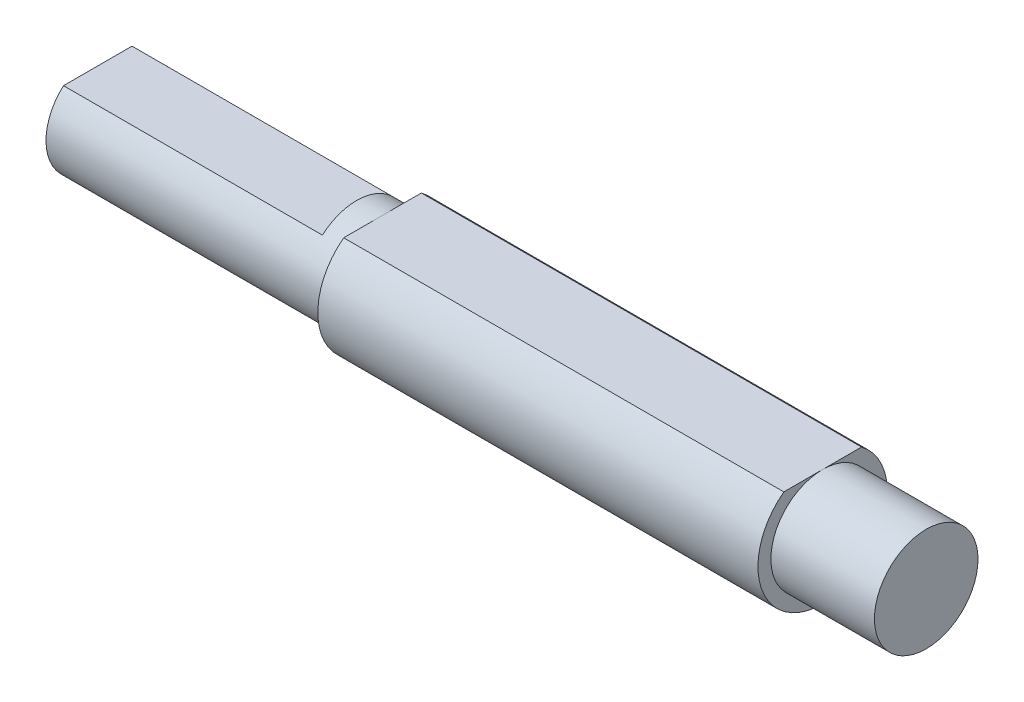
ISO-10303-21;
HEADER;
FILE_DESCRIPTION(('STEP AP214'),'2;1');
FILE_NAME('part.step','',(''),(''),'','','');
FILE_SCHEMA(('AUTOMOTIVE_DESIGN { 1 0 10303 214 1 1 1 1 }'));
ENDSEC;
DATA;
#1=APPLICATION_CONTEXT('core data for automotive mechanical design processes');
#2=APPLICATION_PROTOCOL_DEFINITION('international standard','automotive_design',2000,#1);
#3=PRODUCT_CONTEXT('',#1,'mechanical');
#4=PRODUCT('Part','Part','',(#3));
#5=PRODUCT_RELATED_PRODUCT_CATEGORY('part','',(#4));
#6=PRODUCT_DEFINITION_FORMATION('','',#4);
#7=PRODUCT_DEFINITION_CONTEXT('part definition',#1,'design');
#8=PRODUCT_DEFINITION('design','',#6,#7);
#9=PRODUCT_DEFINITION_SHAPE('','',#8);
#10=(LENGTH_UNIT() NAMED_UNIT(*) SI_UNIT(.MILLI.,.METRE.));
#11=(NAMED_UNIT(*) PLANE_ANGLE_UNIT() SI_UNIT($,.RADIAN.));
#12=(NAMED_UNIT(*) SI_UNIT($,.STERADIAN.) SOLID_ANGLE_UNIT());
#13=UNCERTAINTY_MEASURE_WITH_UNIT(LENGTH_MEASURE(1.E-05),#10,'distance_accuracy_value','');
#14=(GEOMETRIC_REPRESENTATION_CONTEXT(3) GLOBAL_UNCERTAINTY_ASSIGNED_CONTEXT((#13)) GLOBAL_UNIT_ASSIGNED_CONTEXT((#10,
#11,#12)) REPRESENTATION_CONTEXT('',''));
#15=CARTESIAN_POINT('',(0.,0.,0.));
#16=DIRECTION('',(0.,0.,1.));
#17=DIRECTION('',(1.,0.,0.));
#18=AXIS2_PLACEMENT_3D('',#15,#16,#17);
#19=CARTESIAN_POINT('',(11.5,15.75,0.250000000000031));
#20=DIRECTION('',(1.,0.,0.));
#21=DIRECTION('',(0.,1.,0.));
#22=AXIS2_PLACEMENT_3D('',#19,#20,#21);
#23=CYLINDRICAL_SURFACE('',#22,2.);
#24=CARTESIAN_POINT('',(11.5,15.75,0.250000000000031));
#25=DIRECTION('',(-1.,0.,0.));
#26=DIRECTION('',(0.,-1.,0.));
#27=AXIS2_PLACEMENT_3D('',#24,#25,#26);
#28=CIRCLE('',#27,2.);
#29=CARTESIAN_POINT('',(11.5,17.75,0.250000000000038));
#30=VERTEX_POINT('',#29);
#31=EDGE_CURVE('E39',#30,#30,#28,.T.);
#32=ORIENTED_EDGE('',*,*,#31,.F.);
#33=EDGE_LOOP('',(#32));
#34=FACE_BOUND('',#33,.T.);
#35=CARTESIAN_POINT('',(15.5,15.75,0.250000000000045));
#36=DIRECTION('',(-1.,0.,0.));
#37=DIRECTION('',(0.,-1.,0.));
#38=AXIS2_PLACEMENT_3D('',#35,#36,#37);
#39=CIRCLE('',#38,2.);
#40=CARTESIAN_POINT('',(15.5,13.75,0.250000000000038));
#41=VERTEX_POINT('',#40);
#42=EDGE_CURVE('E114',#41,#41,#39,.T.);
#43=ORIENTED_EDGE('',*,*,#42,.T.);
#44=EDGE_LOOP('',(#43));
#45=FACE_BOUND('',#44,.T.);
#46=ADVANCED_FACE('F32',(#34,#45),#23,.T.);
#47=CARTESIAN_POINT('',(15.5,15.75,0.250000000000045));
#48=DIRECTION('',(-1.,0.,0.));
#49=DIRECTION('',(0.,-1.,0.));
#50=AXIS2_PLACEMENT_3D('',#47,#48,#49);
#51=PLANE('',#50);
#52=ORIENTED_EDGE('',*,*,#42,.F.);
#53=EDGE_LOOP('',(#52));
#54=FACE_BOUND('',#53,.T.);
#55=ADVANCED_FACE('F122',(#54),#51,.F.);
#56=CARTESIAN_POINT('',(-5.5,15.75,0.249999999999972));
#57=DIRECTION('',(1.,0.,0.));
#58=DIRECTION('',(0.,1.,0.));
#59=AXIS2_PLACEMENT_3D('',#56,#57,#58);
#60=CYLINDRICAL_SURFACE('',#59,2.5);
#61=CARTESIAN_POINT('',(-5.5,15.75,0.249999999999972));
#62=DIRECTION('',(-1.,0.,0.));
#63=DIRECTION('',(0.,-1.,0.));
#64=AXIS2_PLACEMENT_3D('',#61,#62,#63);
#65=CIRCLE('',#64,2.5);
#66=CARTESIAN_POINT('',(-5.49999999999999,17.75,-1.25000000000002));
#67=VERTEX_POINT('',#66);
#68=CARTESIAN_POINT('',(-5.50000000000001,17.75,1.74999999999998));
#69=VERTEX_POINT('',#68);
#70=EDGE_CURVE('E111',#67,#69,#65,.T.);
#71=ORIENTED_EDGE('',*,*,#70,.F.);
#72=DIRECTION('',(-1.,0.,0.));
#73=VECTOR('',#72,1.);
#74=CARTESIAN_POINT('',(11.5,17.75,-1.24999999999996));
#75=LINE('',#74,#73);
#76=CARTESIAN_POINT('',(11.5,17.75,-1.24999999999996));
#77=VERTEX_POINT('',#76);
#78=EDGE_CURVE('E105',#77,#67,#75,.T.);
#79=ORIENTED_EDGE('',*,*,#78,.F.);
#80=CARTESIAN_POINT('',(11.5,15.75,0.250000000000031));
#81=DIRECTION('',(-1.,0.,0.));
#82=DIRECTION('',(0.,-1.,0.));
#83=AXIS2_PLACEMENT_3D('',#80,#81,#82);
#84=CIRCLE('',#83,2.5);
#85=CARTESIAN_POINT('',(11.5,17.75,1.75000000000004));
#86=VERTEX_POINT('',#85);
#87=EDGE_CURVE('E109',#77,#86,#84,.T.);
#88=ORIENTED_EDGE('',*,*,#87,.T.);
#89=DIRECTION('',(-1.,0.,0.));
#90=VECTOR('',#89,1.);
#91=CARTESIAN_POINT('',(11.5,17.75,1.75000000000004));
#92=LINE('',#91,#90);
#93=EDGE_CURVE('E54',#86,#69,#92,.T.);
#94=ORIENTED_EDGE('',*,*,#93,.T.);
#95=EDGE_LOOP('',(#71,#79,#88,#94));
#96=FACE_BOUND('',#95,.T.);
#97=ADVANCED_FACE('F124',(#96),#60,.T.);
#98=CARTESIAN_POINT('',(-5.5,15.75,0.249999999999972));
#99=DIRECTION('',(-1.,0.,0.));
#100=DIRECTION('',(0.,-1.,0.));
#101=AXIS2_PLACEMENT_3D('',#98,#99,#100);
#102=PLANE('',#101);
#103=DIRECTION('',(0.,0.,1.));
#104=VECTOR('',#103,1.);
#105=CARTESIAN_POINT('',(-5.50000000000001,17.75,1.74999999999998));
#106=LINE('',#105,#104);
#107=CARTESIAN_POINT('',(-5.5,17.75,0.249999999999979));
#108=VERTEX_POINT('',#107);
#109=EDGE_CURVE('E99',#108,#69,#106,.T.);
#110=ORIENTED_EDGE('',*,*,#109,.F.);
#111=CARTESIAN_POINT('',(-5.5,15.75,0.249999999999972));
#112=DIRECTION('',(-1.,0.,0.));
#113=DIRECTION('',(0.,-1.,0.));
#114=AXIS2_PLACEMENT_3D('',#111,#112,#113);
#115=CIRCLE('',#114,2.);
#116=EDGE_CURVE('E94',#108,#108,#115,.T.);
#117=ORIENTED_EDGE('',*,*,#116,.F.);
#118=EDGE_CURVE('E106',#67,#108,#106,.T.);
#119=ORIENTED_EDGE('',*,*,#118,.F.);
#120=ORIENTED_EDGE('',*,*,#70,.T.);
#121=EDGE_LOOP('',(#110,#117,#119,#120));
#122=FACE_BOUND('',#121,.T.);
#123=ADVANCED_FACE('F129',(#122),#102,.T.);
#124=CARTESIAN_POINT('',(11.5,15.75,0.250000000000031));
#125=DIRECTION('',(-1.,0.,0.));
#126=DIRECTION('',(0.,-1.,0.));
#127=AXIS2_PLACEMENT_3D('',#124,#125,#126);
#128=PLANE('',#127);
#129=ORIENTED_EDGE('',*,*,#87,.F.);
#130=DIRECTION('',(0.,0.,1.));
#131=VECTOR('',#130,1.);
#132=CARTESIAN_POINT('',(11.5,17.75,1.75000000000004));
#133=LINE('',#132,#131);
#134=EDGE_CURVE('E102',#77,#30,#133,.T.);
#135=ORIENTED_EDGE('',*,*,#134,.T.);
#136=ORIENTED_EDGE('',*,*,#31,.T.);
#137=DIRECTION('',(0.,0.,1.));
#138=VECTOR('',#137,1.);
#139=CARTESIAN_POINT('',(11.5,17.75,0.250000000000038));
#140=LINE('',#139,#138);
#141=EDGE_CURVE('E11',#30,#86,#140,.T.);
#142=ORIENTED_EDGE('',*,*,#141,.T.);
#143=EDGE_LOOP('',(#129,#135,#136,#142));
#144=FACE_BOUND('',#143,.T.);
#145=ADVANCED_FACE('F134',(#144),#128,.F.);
#146=CARTESIAN_POINT('',(11.5,17.75,1.75000000000004));
#147=DIRECTION('',(0.,-1.,0.));
#148=DIRECTION('',(0.,0.,1.));
#149=AXIS2_PLACEMENT_3D('',#146,#147,#148);
#150=PLANE('',#149);
#151=ORIENTED_EDGE('',*,*,#118,.T.);
#152=ORIENTED_EDGE('',*,*,#109,.T.);
#153=ORIENTED_EDGE('',*,*,#93,.F.);
#154=ORIENTED_EDGE('',*,*,#141,.F.);
#155=ORIENTED_EDGE('',*,*,#134,.F.);
#156=ORIENTED_EDGE('',*,*,#78,.T.);
#157=EDGE_LOOP('',(#151,#152,#153,#154,#155,#156));
#158=FACE_BOUND('',#157,.T.);
#159=ADVANCED_FACE('F137',(#158),#150,.F.);
#160=CARTESIAN_POINT('',(-16.5,15.75,0.249999999999934));
#161=DIRECTION('',(1.,0.,0.));
#162=DIRECTION('',(0.,1.,0.));
#163=AXIS2_PLACEMENT_3D('',#160,#161,#162);
#164=CYLINDRICAL_SURFACE('',#163,2.);
#165=CARTESIAN_POINT('',(-16.5,15.75,0.249999999999934));
#166=DIRECTION('',(-1.,0.,0.));
#167=DIRECTION('',(0.,-1.,0.));
#168=AXIS2_PLACEMENT_3D('',#165,#166,#167);
#169=CIRCLE('',#168,2.);
#170=CARTESIAN_POINT('',(-16.5,17.25,-1.07287565553236));
#171=VERTEX_POINT('',#170);
#172=CARTESIAN_POINT('',(-16.5,17.25,1.57287565553223));
#173=VERTEX_POINT('',#172);
#174=EDGE_CURVE('E92',#171,#173,#169,.T.);
#175=ORIENTED_EDGE('',*,*,#174,.F.);
#176=DIRECTION('',(-1.,0.,0.));
#177=VECTOR('',#176,1.);
#178=CARTESIAN_POINT('',(-6.5,17.25,-1.07287565553232));
#179=LINE('',#178,#177);
#180=CARTESIAN_POINT('',(-6.5,17.25,-1.07287565553232));
#181=VERTEX_POINT('',#180);
#182=EDGE_CURVE('E46',#181,#171,#179,.T.);
#183=ORIENTED_EDGE('',*,*,#182,.F.);
#184=CARTESIAN_POINT('',(-6.5,15.75,0.249999999999969));
#185=DIRECTION('',(-1.,0.,0.));
#186=DIRECTION('',(0.,0.,1.));
#187=AXIS2_PLACEMENT_3D('',#184,#185,#186);
#188=CIRCLE('',#187,1.99999999999998);
#189=CARTESIAN_POINT('',(-6.50000000000001,17.25,1.57287565553226));
#190=VERTEX_POINT('',#189);
#191=EDGE_CURVE('E78',#190,#181,#188,.T.);
#192=ORIENTED_EDGE('',*,*,#191,.F.);
#193=DIRECTION('',(-1.,0.,0.));
#194=VECTOR('',#193,1.);
#195=CARTESIAN_POINT('',(-6.50000000000001,17.25,1.57287565553226));
#196=LINE('',#195,#194);
#197=EDGE_CURVE('E86',#190,#173,#196,.T.);
#198=ORIENTED_EDGE('',*,*,#197,.T.);
#199=EDGE_LOOP('',(#175,#183,#192,#198));
#200=FACE_BOUND('',#199,.T.);
#201=ORIENTED_EDGE('',*,*,#116,.T.);
#202=EDGE_LOOP('',(#201));
#203=FACE_BOUND('',#202,.T.);
#204=ADVANCED_FACE('F89',(#200,#203),#164,.T.);
#205=CARTESIAN_POINT('',(-16.5,15.75,0.249999999999934));
#206=DIRECTION('',(-1.,0.,0.));
#207=DIRECTION('',(0.,-1.,0.));
#208=AXIS2_PLACEMENT_3D('',#205,#206,#207);
#209=PLANE('',#208);
#210=DIRECTION('',(0.,0.,1.));
#211=VECTOR('',#210,1.);
#212=CARTESIAN_POINT('',(-16.5,17.25,-1.07287565553236));
#213=LINE('',#212,#211);
#214=EDGE_CURVE('E83',#171,#173,#213,.T.);
#215=ORIENTED_EDGE('',*,*,#214,.F.);
#216=ORIENTED_EDGE('',*,*,#174,.T.);
#217=EDGE_LOOP('',(#215,#216));
#218=FACE_BOUND('',#217,.T.);
#219=ADVANCED_FACE('F146',(#218),#209,.T.);
#220=CARTESIAN_POINT('',(-6.5,17.25,-1.07287565553232));
#221=DIRECTION('',(0.,-1.,0.));
#222=DIRECTION('',(1.,0.,0.));
#223=AXIS2_PLACEMENT_3D('',#220,#221,#222);
#224=PLANE('',#223);
#225=ORIENTED_EDGE('',*,*,#214,.T.);
#226=ORIENTED_EDGE('',*,*,#197,.F.);
#227=DIRECTION('',(0.,0.,1.));
#228=VECTOR('',#227,1.);
#229=CARTESIAN_POINT('',(-6.5,17.25,-1.07287565553232));
#230=LINE('',#229,#228);
#231=EDGE_CURVE('E80',#181,#190,#230,.T.);
#232=ORIENTED_EDGE('',*,*,#231,.F.);
#233=ORIENTED_EDGE('',*,*,#182,.T.);
#234=EDGE_LOOP('',(#225,#226,#232,#233));
#235=FACE_BOUND('',#234,.T.);
#236=ADVANCED_FACE('F85',(#235),#224,.F.);
#237=CARTESIAN_POINT('',(-6.5,15.75,0.249999999999969));
#238=DIRECTION('',(-1.,0.,0.));
#239=DIRECTION('',(0.,0.,1.));
#240=AXIS2_PLACEMENT_3D('',#237,#238,#239);
#241=PLANE('',#240);
#242=ORIENTED_EDGE('',*,*,#191,.T.);
#243=ORIENTED_EDGE('',*,*,#231,.T.);
#244=EDGE_LOOP('',(#242,#243));
#245=FACE_BOUND('',#244,.T.);
#246=ADVANCED_FACE('F79',(#245),#241,.T.);
#247=CLOSED_SHELL('',(#46,#55,#97,#123,#145,#159,#204,#219,#236,#246));
#248=MANIFOLD_SOLID_BREP('B2',#247);
#249=ADVANCED_BREP_SHAPE_REPRESENTATION('',(#18,#248),#14);
#250=SHAPE_DEFINITION_REPRESENTATION(#9,#249);
ENDSEC;
END-ISO-10303-21;
